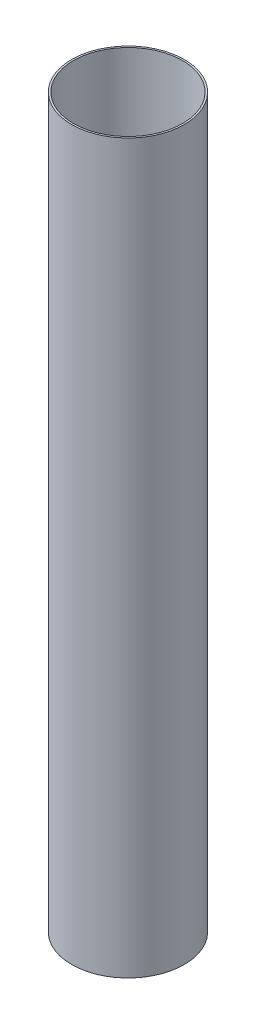
ISO-10303-21;
HEADER;
FILE_DESCRIPTION(('STEP AP214'),'2;1');
FILE_NAME('part.step','',(''),(''),'','','');
FILE_SCHEMA(('AUTOMOTIVE_DESIGN { 1 0 10303 214 1 1 1 1 }'));
ENDSEC;
DATA;
#1=APPLICATION_CONTEXT('core data for automotive mechanical design processes');
#2=APPLICATION_PROTOCOL_DEFINITION('international standard','automotive_design',2000,#1);
#3=PRODUCT_CONTEXT('',#1,'mechanical');
#4=PRODUCT('Part','Part','',(#3));
#5=PRODUCT_RELATED_PRODUCT_CATEGORY('part','',(#4));
#6=PRODUCT_DEFINITION_FORMATION('','',#4);
#7=PRODUCT_DEFINITION_CONTEXT('part definition',#1,'design');
#8=PRODUCT_DEFINITION('design','',#6,#7);
#9=PRODUCT_DEFINITION_SHAPE('','',#8);
#10=(LENGTH_UNIT() NAMED_UNIT(*) SI_UNIT(.MILLI.,.METRE.));
#11=(NAMED_UNIT(*) PLANE_ANGLE_UNIT() SI_UNIT($,.RADIAN.));
#12=(NAMED_UNIT(*) SI_UNIT($,.STERADIAN.) SOLID_ANGLE_UNIT());
#13=UNCERTAINTY_MEASURE_WITH_UNIT(LENGTH_MEASURE(1.E-05),#10,'distance_accuracy_value','');
#14=(GEOMETRIC_REPRESENTATION_CONTEXT(3) GLOBAL_UNCERTAINTY_ASSIGNED_CONTEXT((#13)) GLOBAL_UNIT_ASSIGNED_CONTEXT((#10,
#11,#12)) REPRESENTATION_CONTEXT('',''));
#15=CARTESIAN_POINT('',(0.,0.,0.));
#16=DIRECTION('',(0.,0.,1.));
#17=DIRECTION('',(1.,0.,0.));
#18=AXIS2_PLACEMENT_3D('',#15,#16,#17);
#19=CARTESIAN_POINT('',(0.,508.,0.));
#20=DIRECTION('',(0.,1.,0.));
#21=DIRECTION('',(0.,0.,1.));
#22=AXIS2_PLACEMENT_3D('',#19,#20,#21);
#23=PLANE('',#22);
#24=CARTESIAN_POINT('',(0.,508.,0.));
#25=DIRECTION('',(0.,1.,0.));
#26=DIRECTION('',(0.,0.,1.));
#27=AXIS2_PLACEMENT_3D('',#24,#25,#26);
#28=CIRCLE('',#27,39.35);
#29=CARTESIAN_POINT('',(0.,508.,39.35));
#30=VERTEX_POINT('',#29);
#31=EDGE_CURVE('E10',#30,#30,#28,.T.);
#32=ORIENTED_EDGE('',*,*,#31,.T.);
#33=EDGE_LOOP('',(#32));
#34=FACE_BOUND('',#33,.T.);
#35=CARTESIAN_POINT('',(0.,508.,0.));
#36=DIRECTION('',(0.,1.,0.));
#37=DIRECTION('',(0.,0.,1.));
#38=AXIS2_PLACEMENT_3D('',#35,#36,#37);
#39=CIRCLE('',#38,38.1);
#40=CARTESIAN_POINT('',(0.,508.,38.1));
#41=VERTEX_POINT('',#40);
#42=EDGE_CURVE('E56',#41,#41,#39,.T.);
#43=ORIENTED_EDGE('',*,*,#42,.F.);
#44=EDGE_LOOP('',(#43));
#45=FACE_BOUND('',#44,.T.);
#46=ADVANCED_FACE('F43',(#34,#45),#23,.T.);
#47=CARTESIAN_POINT('',(0.,0.,0.));
#48=DIRECTION('',(0.,1.,0.));
#49=DIRECTION('',(0.,0.,1.));
#50=AXIS2_PLACEMENT_3D('',#47,#48,#49);
#51=PLANE('',#50);
#52=CARTESIAN_POINT('',(0.,0.,0.));
#53=DIRECTION('',(0.,1.,0.));
#54=DIRECTION('',(0.,0.,1.));
#55=AXIS2_PLACEMENT_3D('',#52,#53,#54);
#56=CIRCLE('',#55,39.35);
#57=CARTESIAN_POINT('',(0.,0.,39.35));
#58=VERTEX_POINT('',#57);
#59=EDGE_CURVE('E47',#58,#58,#56,.T.);
#60=ORIENTED_EDGE('',*,*,#59,.F.);
#61=EDGE_LOOP('',(#60));
#62=FACE_BOUND('',#61,.T.);
#63=CARTESIAN_POINT('',(0.,0.,0.));
#64=DIRECTION('',(0.,1.,0.));
#65=DIRECTION('',(0.,0.,1.));
#66=AXIS2_PLACEMENT_3D('',#63,#64,#65);
#67=CIRCLE('',#66,38.1);
#68=CARTESIAN_POINT('',(0.,0.,38.1));
#69=VERTEX_POINT('',#68);
#70=EDGE_CURVE('E58',#69,#69,#67,.T.);
#71=ORIENTED_EDGE('',*,*,#70,.T.);
#72=EDGE_LOOP('',(#71));
#73=FACE_BOUND('',#72,.T.);
#74=ADVANCED_FACE('F70',(#62,#73),#51,.F.);
#75=CARTESIAN_POINT('',(0.,508.,0.));
#76=DIRECTION('',(0.,-1.,0.));
#77=DIRECTION('',(0.,0.,-1.));
#78=AXIS2_PLACEMENT_3D('',#75,#76,#77);
#79=CYLINDRICAL_SURFACE('',#78,39.35);
#80=ORIENTED_EDGE('',*,*,#31,.F.);
#81=EDGE_LOOP('',(#80));
#82=FACE_BOUND('',#81,.T.);
#83=ORIENTED_EDGE('',*,*,#59,.T.);
#84=EDGE_LOOP('',(#83));
#85=FACE_BOUND('',#84,.T.);
#86=ADVANCED_FACE('F45',(#82,#85),#79,.T.);
#87=CARTESIAN_POINT('',(0.,508.,0.));
#88=DIRECTION('',(0.,-1.,0.));
#89=DIRECTION('',(0.,0.,-1.));
#90=AXIS2_PLACEMENT_3D('',#87,#88,#89);
#91=CYLINDRICAL_SURFACE('',#90,38.1);
#92=ORIENTED_EDGE('',*,*,#42,.T.);
#93=EDGE_LOOP('',(#92));
#94=FACE_BOUND('',#93,.T.);
#95=ORIENTED_EDGE('',*,*,#70,.F.);
#96=EDGE_LOOP('',(#95));
#97=FACE_BOUND('',#96,.T.);
#98=ADVANCED_FACE('F66',(#94,#97),#91,.F.);
#99=CLOSED_SHELL('',(#46,#74,#86,#98));
#100=MANIFOLD_SOLID_BREP('B2',#99);
#101=ADVANCED_BREP_SHAPE_REPRESENTATION('',(#18,#100),#14);
#102=SHAPE_DEFINITION_REPRESENTATION(#9,#101);
ENDSEC;
END-ISO-10303-21;
